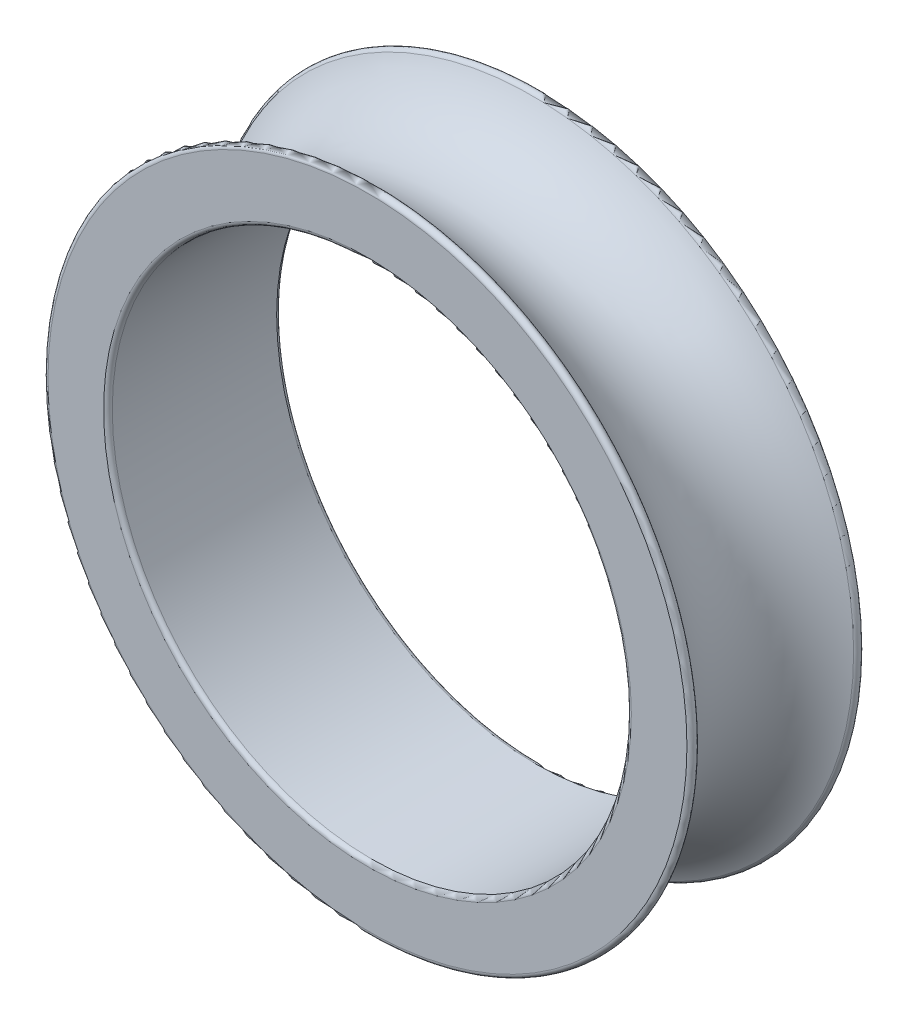
ISO-10303-21;
HEADER;
FILE_DESCRIPTION(('STEP AP214'),'2;1');
FILE_NAME('part.step','',(''),(''),'','','');
FILE_SCHEMA(('AUTOMOTIVE_DESIGN { 1 0 10303 214 1 1 1 1 }'));
ENDSEC;
DATA;
#1=APPLICATION_CONTEXT('core data for automotive mechanical design processes');
#2=APPLICATION_PROTOCOL_DEFINITION('international standard','automotive_design',2000,#1);
#3=PRODUCT_CONTEXT('',#1,'mechanical');
#4=PRODUCT('Part','Part','',(#3));
#5=PRODUCT_RELATED_PRODUCT_CATEGORY('part','',(#4));
#6=PRODUCT_DEFINITION_FORMATION('','',#4);
#7=PRODUCT_DEFINITION_CONTEXT('part definition',#1,'design');
#8=PRODUCT_DEFINITION('design','',#6,#7);
#9=PRODUCT_DEFINITION_SHAPE('','',#8);
#10=(LENGTH_UNIT() NAMED_UNIT(*) SI_UNIT(.MILLI.,.METRE.));
#11=(NAMED_UNIT(*) PLANE_ANGLE_UNIT() SI_UNIT($,.RADIAN.));
#12=(NAMED_UNIT(*) SI_UNIT($,.STERADIAN.) SOLID_ANGLE_UNIT());
#13=UNCERTAINTY_MEASURE_WITH_UNIT(LENGTH_MEASURE(1.E-05),#10,'distance_accuracy_value','');
#14=(GEOMETRIC_REPRESENTATION_CONTEXT(3) GLOBAL_UNCERTAINTY_ASSIGNED_CONTEXT((#13)) GLOBAL_UNIT_ASSIGNED_CONTEXT((#10,
#11,#12)) REPRESENTATION_CONTEXT('',''));
#15=CARTESIAN_POINT('',(0.,0.,0.));
#16=DIRECTION('',(0.,0.,1.));
#17=DIRECTION('',(1.,0.,0.));
#18=AXIS2_PLACEMENT_3D('',#15,#16,#17);
#19=CARTESIAN_POINT('',(0.,0.,10.));
#20=DIRECTION('',(0.,0.,1.));
#21=DIRECTION('',(1.,0.,0.));
#22=AXIS2_PLACEMENT_3D('',#19,#20,#21);
#23=PLANE('',#22);
#24=CARTESIAN_POINT('',(0.,0.,10.));
#25=DIRECTION('',(0.,0.,1.));
#26=DIRECTION('',(1.,0.,0.));
#27=AXIS2_PLACEMENT_3D('',#24,#25,#26);
#28=CIRCLE('',#27,15.25);
#29=CARTESIAN_POINT('',(15.25,0.,10.));
#30=VERTEX_POINT('',#29);
#31=EDGE_CURVE('E67',#30,#30,#28,.F.);
#32=ORIENTED_EDGE('',*,*,#31,.T.);
#33=EDGE_LOOP('',(#32));
#34=FACE_BOUND('',#33,.T.);
#35=CARTESIAN_POINT('',(0.,0.,10.));
#36=DIRECTION('',(0.,0.,1.));
#37=DIRECTION('',(1.,0.,0.));
#38=AXIS2_PLACEMENT_3D('',#35,#36,#37);
#39=CIRCLE('',#38,18.4632810758579);
#40=CARTESIAN_POINT('',(18.4632810758579,0.,10.));
#41=VERTEX_POINT('',#40);
#42=EDGE_CURVE('E71',#41,#41,#39,.T.);
#43=ORIENTED_EDGE('',*,*,#42,.T.);
#44=EDGE_LOOP('',(#43));
#45=FACE_BOUND('',#44,.T.);
#46=ADVANCED_FACE('F43',(#34,#45),#23,.T.);
#47=CARTESIAN_POINT('',(0.,0.,0.));
#48=DIRECTION('',(0.,0.,1.));
#49=DIRECTION('',(1.,0.,0.));
#50=AXIS2_PLACEMENT_3D('',#47,#48,#49);
#51=PLANE('',#50);
#52=CARTESIAN_POINT('',(0.,0.,0.));
#53=DIRECTION('',(0.,0.,1.));
#54=DIRECTION('',(1.,0.,0.));
#55=AXIS2_PLACEMENT_3D('',#52,#53,#54);
#56=CIRCLE('',#55,15.25);
#57=CARTESIAN_POINT('',(15.25,0.,0.));
#58=VERTEX_POINT('',#57);
#59=EDGE_CURVE('E10',#58,#58,#56,.T.);
#60=ORIENTED_EDGE('',*,*,#59,.T.);
#61=EDGE_LOOP('',(#60));
#62=FACE_BOUND('',#61,.T.);
#63=CARTESIAN_POINT('',(0.,0.,0.));
#64=DIRECTION('',(0.,0.,1.));
#65=DIRECTION('',(1.,0.,0.));
#66=AXIS2_PLACEMENT_3D('',#63,#64,#65);
#67=CIRCLE('',#66,18.4632810758579);
#68=CARTESIAN_POINT('',(18.4632810758579,0.,0.));
#69=VERTEX_POINT('',#68);
#70=EDGE_CURVE('E51',#69,#69,#67,.F.);
#71=ORIENTED_EDGE('',*,*,#70,.T.);
#72=EDGE_LOOP('',(#71));
#73=FACE_BOUND('',#72,.T.);
#74=ADVANCED_FACE('F99',(#62,#73),#51,.F.);
#75=CARTESIAN_POINT('',(0.,0.,0.));
#76=DIRECTION('',(0.,0.,1.));
#77=DIRECTION('',(1.,0.,0.));
#78=AXIS2_PLACEMENT_3D('',#75,#76,#77);
#79=CYLINDRICAL_SURFACE('',#78,15.);
#80=CARTESIAN_POINT('',(0.,0.,9.75));
#81=DIRECTION('',(0.,0.,1.));
#82=DIRECTION('',(1.,0.,0.));
#83=AXIS2_PLACEMENT_3D('',#80,#81,#82);
#84=CIRCLE('',#83,15.);
#85=CARTESIAN_POINT('',(15.,0.,9.75));
#86=VERTEX_POINT('',#85);
#87=EDGE_CURVE('E75',#86,#86,#84,.T.);
#88=ORIENTED_EDGE('',*,*,#87,.T.);
#89=EDGE_LOOP('',(#88));
#90=FACE_BOUND('',#89,.T.);
#91=CARTESIAN_POINT('',(0.,0.,0.25));
#92=DIRECTION('',(0.,0.,1.));
#93=DIRECTION('',(1.,0.,0.));
#94=AXIS2_PLACEMENT_3D('',#91,#92,#93);
#95=CIRCLE('',#94,15.);
#96=CARTESIAN_POINT('',(15.,0.,0.25));
#97=VERTEX_POINT('',#96);
#98=EDGE_CURVE('E79',#97,#97,#95,.F.);
#99=ORIENTED_EDGE('',*,*,#98,.T.);
#100=EDGE_LOOP('',(#99));
#101=FACE_BOUND('',#100,.T.);
#102=ADVANCED_FACE('F84',(#90,#101),#79,.F.);
#103=CARTESIAN_POINT('',(0.,0.,5.));
#104=DIRECTION('',(0.,0.,-1.));
#105=DIRECTION('',(-1.,0.,0.));
#106=AXIS2_PLACEMENT_3D('',#103,#104,#105);
#107=TOROIDAL_SURFACE('',#106,20.7179489603025,5.00794896030246);
#108=CARTESIAN_POINT('',(0.,0.,9.5241514782731));
#109=DIRECTION('',(0.,0.,-1.));
#110=DIRECTION('',(-1.,0.,0.));
#111=AXIS2_PLACEMENT_3D('',#108,#109,#110);
#112=CIRCLE('',#111,18.5704838987394);
#113=CARTESIAN_POINT('',(-18.5704838987394,0.,9.5241514782731));
#114=VERTEX_POINT('',#113);
#115=EDGE_CURVE('E56',#114,#114,#112,.T.);
#116=ORIENTED_EDGE('',*,*,#115,.T.);
#117=EDGE_LOOP('',(#116));
#118=FACE_BOUND('',#117,.T.);
#119=CARTESIAN_POINT('',(0.,0.,0.475848521726888));
#120=DIRECTION('',(0.,0.,1.));
#121=DIRECTION('',(1.,0.,0.));
#122=AXIS2_PLACEMENT_3D('',#119,#120,#121);
#123=CIRCLE('',#122,18.5704838987394);
#124=CARTESIAN_POINT('',(18.5704838987394,0.,0.475848521726888));
#125=VERTEX_POINT('',#124);
#126=EDGE_CURVE('E61',#125,#125,#123,.T.);
#127=ORIENTED_EDGE('',*,*,#126,.T.);
#128=EDGE_LOOP('',(#127));
#129=FACE_BOUND('',#128,.T.);
#130=ADVANCED_FACE('F111',(#118,#129),#107,.F.);
#131=CARTESIAN_POINT('',(0.,0.,9.75));
#132=DIRECTION('',(0.,0.,1.));
#133=DIRECTION('',(1.,0.,0.));
#134=AXIS2_PLACEMENT_3D('',#131,#132,#133);
#135=TOROIDAL_SURFACE('',#134,15.25,0.25);
#136=ORIENTED_EDGE('',*,*,#31,.F.);
#137=EDGE_LOOP('',(#136));
#138=FACE_BOUND('',#137,.T.);
#139=ORIENTED_EDGE('',*,*,#87,.F.);
#140=EDGE_LOOP('',(#139));
#141=FACE_BOUND('',#140,.T.);
#142=ADVANCED_FACE('F95',(#138,#141),#135,.T.);
#143=CARTESIAN_POINT('',(0.,0.,9.75));
#144=DIRECTION('',(0.,0.,-1.));
#145=DIRECTION('',(-1.,0.,0.));
#146=AXIS2_PLACEMENT_3D('',#143,#144,#145);
#147=TOROIDAL_SURFACE('',#146,18.4632810758579,0.25);
#148=ORIENTED_EDGE('',*,*,#42,.F.);
#149=EDGE_LOOP('',(#148));
#150=FACE_BOUND('',#149,.T.);
#151=ORIENTED_EDGE('',*,*,#115,.F.);
#152=EDGE_LOOP('',(#151));
#153=FACE_BOUND('',#152,.T.);
#154=ADVANCED_FACE('F89',(#150,#153),#147,.T.);
#155=CARTESIAN_POINT('',(0.,0.,0.25));
#156=DIRECTION('',(0.,0.,1.));
#157=DIRECTION('',(1.,0.,0.));
#158=AXIS2_PLACEMENT_3D('',#155,#156,#157);
#159=TOROIDAL_SURFACE('',#158,15.25,0.25);
#160=ORIENTED_EDGE('',*,*,#98,.F.);
#161=EDGE_LOOP('',(#160));
#162=FACE_BOUND('',#161,.T.);
#163=ORIENTED_EDGE('',*,*,#59,.F.);
#164=EDGE_LOOP('',(#163));
#165=FACE_BOUND('',#164,.T.);
#166=ADVANCED_FACE('F86',(#162,#165),#159,.T.);
#167=CARTESIAN_POINT('',(0.,0.,0.25));
#168=DIRECTION('',(0.,0.,-1.));
#169=DIRECTION('',(-1.,0.,0.));
#170=AXIS2_PLACEMENT_3D('',#167,#168,#169);
#171=TOROIDAL_SURFACE('',#170,18.4632810758579,0.25);
#172=ORIENTED_EDGE('',*,*,#126,.F.);
#173=EDGE_LOOP('',(#172));
#174=FACE_BOUND('',#173,.T.);
#175=ORIENTED_EDGE('',*,*,#70,.F.);
#176=EDGE_LOOP('',(#175));
#177=FACE_BOUND('',#176,.T.);
#178=ADVANCED_FACE('F45',(#174,#177),#171,.T.);
#179=CLOSED_SHELL('',(#46,#74,#102,#130,#142,#154,#166,#178));
#180=MANIFOLD_SOLID_BREP('B2',#179);
#181=ADVANCED_BREP_SHAPE_REPRESENTATION('',(#18,#180),#14);
#182=SHAPE_DEFINITION_REPRESENTATION(#9,#181);
ENDSEC;
END-ISO-10303-21;
